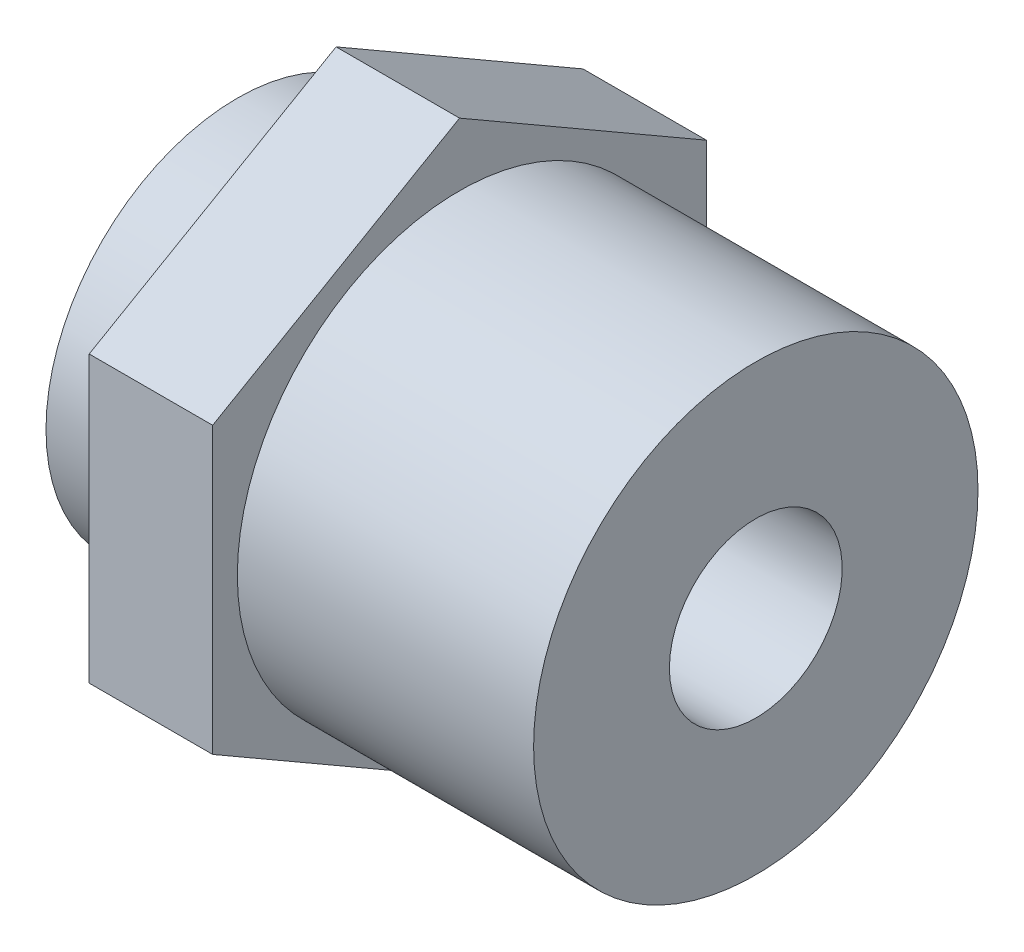
ISO-10303-21;
HEADER;
FILE_DESCRIPTION(('STEP AP214'),'2;1');
FILE_NAME('part.step','',(''),(''),'','','');
FILE_SCHEMA(('AUTOMOTIVE_DESIGN { 1 0 10303 214 1 1 1 1 }'));
ENDSEC;
DATA;
#1=APPLICATION_CONTEXT('core data for automotive mechanical design processes');
#2=APPLICATION_PROTOCOL_DEFINITION('international standard','automotive_design',2000,#1);
#3=PRODUCT_CONTEXT('',#1,'mechanical');
#4=PRODUCT('Part','Part','',(#3));
#5=PRODUCT_RELATED_PRODUCT_CATEGORY('part','',(#4));
#6=PRODUCT_DEFINITION_FORMATION('','',#4);
#7=PRODUCT_DEFINITION_CONTEXT('part definition',#1,'design');
#8=PRODUCT_DEFINITION('design','',#6,#7);
#9=PRODUCT_DEFINITION_SHAPE('','',#8);
#10=(LENGTH_UNIT() NAMED_UNIT(*) SI_UNIT(.MILLI.,.METRE.));
#11=(NAMED_UNIT(*) PLANE_ANGLE_UNIT() SI_UNIT($,.RADIAN.));
#12=(NAMED_UNIT(*) SI_UNIT($,.STERADIAN.) SOLID_ANGLE_UNIT());
#13=UNCERTAINTY_MEASURE_WITH_UNIT(LENGTH_MEASURE(1.E-05),#10,'distance_accuracy_value','');
#14=(GEOMETRIC_REPRESENTATION_CONTEXT(3) GLOBAL_UNCERTAINTY_ASSIGNED_CONTEXT((#13)) GLOBAL_UNIT_ASSIGNED_CONTEXT((#10,
#11,#12)) REPRESENTATION_CONTEXT('',''));
#15=CARTESIAN_POINT('',(0.,0.,0.));
#16=DIRECTION('',(0.,0.,1.));
#17=DIRECTION('',(1.,0.,0.));
#18=AXIS2_PLACEMENT_3D('',#15,#16,#17);
#19=CARTESIAN_POINT('',(-8.,0.,0.));
#20=DIRECTION('',(1.,0.,0.));
#21=DIRECTION('',(0.,0.,1.));
#22=AXIS2_PLACEMENT_3D('',#19,#20,#21);
#23=CYLINDRICAL_SURFACE('',#22,3.5);
#24=DIRECTION('',(1.,0.,0.));
#25=VECTOR('',#24,1.);
#26=CARTESIAN_POINT('',(-8.,0.,3.5));
#27=LINE('',#26,#25);
#28=CARTESIAN_POINT('',(-4.,0.,3.5));
#29=VERTEX_POINT('',#28);
#30=CARTESIAN_POINT('',(17.,0.,3.5));
#31=VERTEX_POINT('',#30);
#32=EDGE_CURVE('E9',#29,#31,#27,.T.);
#33=ORIENTED_EDGE('',*,*,#32,.F.);
#34=CARTESIAN_POINT('',(-4.,0.,0.));
#35=DIRECTION('',(1.,0.,0.));
#36=DIRECTION('',(0.,0.,1.));
#37=AXIS2_PLACEMENT_3D('',#34,#35,#36);
#38=CIRCLE('',#37,3.5);
#39=EDGE_CURVE('E169',#29,#29,#38,.T.);
#40=ORIENTED_EDGE('',*,*,#39,.F.);
#41=ORIENTED_EDGE('',*,*,#32,.T.);
#42=CARTESIAN_POINT('',(17.,0.,0.));
#43=DIRECTION('',(1.,0.,0.));
#44=DIRECTION('',(0.,0.,1.));
#45=AXIS2_PLACEMENT_3D('',#42,#43,#44);
#46=CIRCLE('',#45,3.5);
#47=EDGE_CURVE('E25',#31,#31,#46,.T.);
#48=ORIENTED_EDGE('',*,*,#47,.T.);
#49=EDGE_LOOP('',(#33,#40,#41,#48));
#50=FACE_BOUND('',#49,.T.);
#51=ADVANCED_FACE('F15',(#50),#23,.F.);
#52=CARTESIAN_POINT('',(17.,0.,0.));
#53=DIRECTION('',(1.,0.,0.));
#54=DIRECTION('',(0.,1.,0.));
#55=AXIS2_PLACEMENT_3D('',#52,#53,#54);
#56=PLANE('',#55);
#57=ORIENTED_EDGE('',*,*,#47,.F.);
#58=EDGE_LOOP('',(#57));
#59=FACE_BOUND('',#58,.T.);
#60=CARTESIAN_POINT('',(17.,0.,0.));
#61=DIRECTION('',(1.,0.,0.));
#62=DIRECTION('',(0.,0.,1.));
#63=AXIS2_PLACEMENT_3D('',#60,#61,#62);
#64=CIRCLE('',#63,9.);
#65=CARTESIAN_POINT('',(17.,0.,9.));
#66=VERTEX_POINT('',#65);
#67=EDGE_CURVE('E205',#66,#66,#64,.T.);
#68=ORIENTED_EDGE('',*,*,#67,.T.);
#69=EDGE_LOOP('',(#68));
#70=FACE_BOUND('',#69,.T.);
#71=ADVANCED_FACE('F220',(#59,#70),#56,.T.);
#72=CARTESIAN_POINT('',(-4.,0.,0.));
#73=DIRECTION('',(1.,0.,0.));
#74=DIRECTION('',(0.,1.,0.));
#75=AXIS2_PLACEMENT_3D('',#72,#73,#74);
#76=PLANE('',#75);
#77=ORIENTED_EDGE('',*,*,#39,.T.);
#78=EDGE_LOOP('',(#77));
#79=FACE_BOUND('',#78,.T.);
#80=CARTESIAN_POINT('',(-4.,0.,0.));
#81=DIRECTION('',(1.,0.,0.));
#82=DIRECTION('',(0.,0.,1.));
#83=AXIS2_PLACEMENT_3D('',#80,#81,#82);
#84=CIRCLE('',#83,7.75);
#85=CARTESIAN_POINT('',(-4.,0.,7.75));
#86=VERTEX_POINT('',#85);
#87=EDGE_CURVE('E82',#86,#86,#84,.T.);
#88=ORIENTED_EDGE('',*,*,#87,.F.);
#89=EDGE_LOOP('',(#88));
#90=FACE_BOUND('',#89,.T.);
#91=ADVANCED_FACE('F17',(#79,#90),#76,.F.);
#92=CARTESIAN_POINT('',(5.,0.,0.));
#93=DIRECTION('',(1.,0.,0.));
#94=DIRECTION('',(0.,0.,1.));
#95=AXIS2_PLACEMENT_3D('',#92,#93,#94);
#96=CYLINDRICAL_SURFACE('',#95,9.);
#97=ORIENTED_EDGE('',*,*,#67,.F.);
#98=DIRECTION('',(1.,0.,0.));
#99=VECTOR('',#98,1.);
#100=CARTESIAN_POINT('',(5.,0.,9.));
#101=LINE('',#100,#99);
#102=CARTESIAN_POINT('',(5.,0.,9.));
#103=VERTEX_POINT('',#102);
#104=EDGE_CURVE('E95',#103,#66,#101,.T.);
#105=ORIENTED_EDGE('',*,*,#104,.F.);
#106=CARTESIAN_POINT('',(5.,0.,0.));
#107=DIRECTION('',(1.,0.,0.));
#108=DIRECTION('',(0.,0.,1.));
#109=AXIS2_PLACEMENT_3D('',#106,#107,#108);
#110=CIRCLE('',#109,9.);
#111=EDGE_CURVE('E194',#103,#103,#110,.T.);
#112=ORIENTED_EDGE('',*,*,#111,.T.);
#113=ORIENTED_EDGE('',*,*,#104,.T.);
#114=EDGE_LOOP('',(#97,#105,#112,#113));
#115=FACE_BOUND('',#114,.T.);
#116=ADVANCED_FACE('F222',(#115),#96,.T.);
#117=CARTESIAN_POINT('',(-4.,0.,0.));
#118=DIRECTION('',(1.,0.,0.));
#119=DIRECTION('',(0.,0.,1.));
#120=AXIS2_PLACEMENT_3D('',#117,#118,#119);
#121=CYLINDRICAL_SURFACE('',#120,7.75);
#122=CARTESIAN_POINT('',(0.,0.,0.));
#123=DIRECTION('',(1.,0.,0.));
#124=DIRECTION('',(0.,0.,1.));
#125=AXIS2_PLACEMENT_3D('',#122,#123,#124);
#126=CIRCLE('',#125,7.75);
#127=CARTESIAN_POINT('',(0.,0.,7.75));
#128=VERTEX_POINT('',#127);
#129=EDGE_CURVE('E176',#128,#128,#126,.T.);
#130=ORIENTED_EDGE('',*,*,#129,.F.);
#131=DIRECTION('',(1.,0.,0.));
#132=VECTOR('',#131,1.);
#133=CARTESIAN_POINT('',(-4.,0.,7.75));
#134=LINE('',#133,#132);
#135=EDGE_CURVE('E210',#86,#128,#134,.T.);
#136=ORIENTED_EDGE('',*,*,#135,.F.);
#137=ORIENTED_EDGE('',*,*,#87,.T.);
#138=ORIENTED_EDGE('',*,*,#135,.T.);
#139=EDGE_LOOP('',(#130,#136,#137,#138));
#140=FACE_BOUND('',#139,.T.);
#141=ADVANCED_FACE('F254',(#140),#121,.T.);
#142=CARTESIAN_POINT('',(0.,-11.54700538379,0.));
#143=DIRECTION('',(0.,0.866025403784329,0.50000000000019));
#144=DIRECTION('',(1.,0.,0.));
#145=AXIS2_PLACEMENT_3D('',#142,#143,#144);
#146=PLANE('',#145);
#147=DIRECTION('',(0.,0.50000000000019,-0.866025403784329));
#148=VECTOR('',#147,1.);
#149=CARTESIAN_POINT('',(0.,-11.54700538379,0.));
#150=LINE('',#149,#148);
#151=CARTESIAN_POINT('',(0.,-11.54700538379,0.));
#152=VERTEX_POINT('',#151);
#153=CARTESIAN_POINT('',(0.,-5.773502691896,-10.));
#154=VERTEX_POINT('',#153);
#155=EDGE_CURVE('E186',#152,#154,#150,.T.);
#156=ORIENTED_EDGE('',*,*,#155,.T.);
#157=DIRECTION('',(1.,0.,0.));
#158=VECTOR('',#157,1.);
#159=CARTESIAN_POINT('',(0.,-5.773502691896,-10.));
#160=LINE('',#159,#158);
#161=CARTESIAN_POINT('',(5.,-5.773502691896,-10.));
#162=VERTEX_POINT('',#161);
#163=EDGE_CURVE('E196',#154,#162,#160,.T.);
#164=ORIENTED_EDGE('',*,*,#163,.T.);
#165=DIRECTION('',(0.,0.50000000000019,-0.866025403784329));
#166=VECTOR('',#165,1.);
#167=CARTESIAN_POINT('',(5.,-11.54700538379,0.));
#168=LINE('',#167,#166);
#169=CARTESIAN_POINT('',(5.,-11.54700538379,0.));
#170=VERTEX_POINT('',#169);
#171=EDGE_CURVE('E165',#170,#162,#168,.T.);
#172=ORIENTED_EDGE('',*,*,#171,.F.);
#173=DIRECTION('',(1.,0.,0.));
#174=VECTOR('',#173,1.);
#175=CARTESIAN_POINT('',(0.,-11.54700538379,0.));
#176=LINE('',#175,#174);
#177=EDGE_CURVE('E203',#152,#170,#176,.T.);
#178=ORIENTED_EDGE('',*,*,#177,.F.);
#179=EDGE_LOOP('',(#156,#164,#172,#178));
#180=FACE_BOUND('',#179,.T.);
#181=ADVANCED_FACE('F238',(#180),#146,.F.);
#182=CARTESIAN_POINT('',(0.,-5.773502691896,10.));
#183=DIRECTION('',(0.,0.866025403784329,-0.50000000000019));
#184=DIRECTION('',(-1.,0.,0.));
#185=AXIS2_PLACEMENT_3D('',#182,#183,#184);
#186=PLANE('',#185);
#187=DIRECTION('',(0.,-0.50000000000019,-0.866025403784329));
#188=VECTOR('',#187,1.);
#189=CARTESIAN_POINT('',(0.,-5.773502691896,10.));
#190=LINE('',#189,#188);
#191=CARTESIAN_POINT('',(0.,-5.773502691896,10.));
#192=VERTEX_POINT('',#191);
#193=EDGE_CURVE('E179',#192,#152,#190,.T.);
#194=ORIENTED_EDGE('',*,*,#193,.T.);
#195=ORIENTED_EDGE('',*,*,#177,.T.);
#196=DIRECTION('',(0.,-0.50000000000019,-0.866025403784329));
#197=VECTOR('',#196,1.);
#198=CARTESIAN_POINT('',(5.,-5.773502691896,10.));
#199=LINE('',#198,#197);
#200=CARTESIAN_POINT('',(5.,-5.773502691896,10.));
#201=VERTEX_POINT('',#200);
#202=EDGE_CURVE('E170',#201,#170,#199,.T.);
#203=ORIENTED_EDGE('',*,*,#202,.F.);
#204=DIRECTION('',(1.,0.,0.));
#205=VECTOR('',#204,1.);
#206=CARTESIAN_POINT('',(0.,-5.773502691896,10.));
#207=LINE('',#206,#205);
#208=EDGE_CURVE('E160',#192,#201,#207,.T.);
#209=ORIENTED_EDGE('',*,*,#208,.F.);
#210=EDGE_LOOP('',(#194,#195,#203,#209));
#211=FACE_BOUND('',#210,.T.);
#212=ADVANCED_FACE('F233',(#211),#186,.F.);
#213=CARTESIAN_POINT('',(0.,-5.773502691896,-10.));
#214=DIRECTION('',(0.,0.,1.));
#215=DIRECTION('',(0.,-1.,0.));
#216=AXIS2_PLACEMENT_3D('',#213,#214,#215);
#217=PLANE('',#216);
#218=DIRECTION('',(0.,1.,0.));
#219=VECTOR('',#218,1.);
#220=CARTESIAN_POINT('',(0.,-5.773502691896,-10.));
#221=LINE('',#220,#219);
#222=CARTESIAN_POINT('',(0.,5.773502691896,-10.));
#223=VERTEX_POINT('',#222);
#224=EDGE_CURVE('E175',#154,#223,#221,.T.);
#225=ORIENTED_EDGE('',*,*,#224,.T.);
#226=DIRECTION('',(1.,0.,0.));
#227=VECTOR('',#226,1.);
#228=CARTESIAN_POINT('',(0.,5.773502691896,-10.));
#229=LINE('',#228,#227);
#230=CARTESIAN_POINT('',(5.,5.773502691896,-10.));
#231=VERTEX_POINT('',#230);
#232=EDGE_CURVE('E121',#223,#231,#229,.T.);
#233=ORIENTED_EDGE('',*,*,#232,.T.);
#234=DIRECTION('',(0.,1.,0.));
#235=VECTOR('',#234,1.);
#236=CARTESIAN_POINT('',(5.,-5.773502691896,-10.));
#237=LINE('',#236,#235);
#238=EDGE_CURVE('E167',#162,#231,#237,.T.);
#239=ORIENTED_EDGE('',*,*,#238,.F.);
#240=ORIENTED_EDGE('',*,*,#163,.F.);
#241=EDGE_LOOP('',(#225,#233,#239,#240));
#242=FACE_BOUND('',#241,.T.);
#243=ADVANCED_FACE('F227',(#242),#217,.F.);
#244=CARTESIAN_POINT('',(5.,0.,0.));
#245=DIRECTION('',(1.,0.,0.));
#246=DIRECTION('',(0.,1.,0.));
#247=AXIS2_PLACEMENT_3D('',#244,#245,#246);
#248=PLANE('',#247);
#249=ORIENTED_EDGE('',*,*,#111,.F.);
#250=EDGE_LOOP('',(#249));
#251=FACE_BOUND('',#250,.T.);
#252=DIRECTION('',(0.,-0.50000000000019,0.866025403784329));
#253=VECTOR('',#252,1.);
#254=CARTESIAN_POINT('',(5.,11.547005383793,0.));
#255=LINE('',#254,#253);
#256=CARTESIAN_POINT('',(5.,11.547005383793,0.));
#257=VERTEX_POINT('',#256);
#258=CARTESIAN_POINT('',(5.,5.773502691896,10.));
#259=VERTEX_POINT('',#258);
#260=EDGE_CURVE('E133',#257,#259,#255,.T.);
#261=ORIENTED_EDGE('',*,*,#260,.T.);
#262=DIRECTION('',(0.,-1.,0.));
#263=VECTOR('',#262,1.);
#264=CARTESIAN_POINT('',(5.,5.773502691896,10.));
#265=LINE('',#264,#263);
#266=EDGE_CURVE('E161',#259,#201,#265,.T.);
#267=ORIENTED_EDGE('',*,*,#266,.T.);
#268=ORIENTED_EDGE('',*,*,#202,.T.);
#269=ORIENTED_EDGE('',*,*,#171,.T.);
#270=ORIENTED_EDGE('',*,*,#238,.T.);
#271=DIRECTION('',(0.,0.50000000000019,0.866025403784329));
#272=VECTOR('',#271,1.);
#273=CARTESIAN_POINT('',(5.,5.773502691896,-10.));
#274=LINE('',#273,#272);
#275=EDGE_CURVE('E130',#231,#257,#274,.T.);
#276=ORIENTED_EDGE('',*,*,#275,.T.);
#277=EDGE_LOOP('',(#261,#267,#268,#269,#270,#276));
#278=FACE_BOUND('',#277,.T.);
#279=ADVANCED_FACE('F221',(#251,#278),#248,.T.);
#280=CARTESIAN_POINT('',(0.,0.,0.));
#281=DIRECTION('',(1.,0.,0.));
#282=DIRECTION('',(0.,1.,0.));
#283=AXIS2_PLACEMENT_3D('',#280,#281,#282);
#284=PLANE('',#283);
#285=ORIENTED_EDGE('',*,*,#129,.T.);
#286=EDGE_LOOP('',(#285));
#287=FACE_BOUND('',#286,.T.);
#288=DIRECTION('',(0.,0.50000000000019,0.866025403784329));
#289=VECTOR('',#288,1.);
#290=CARTESIAN_POINT('',(0.,5.773502691896,-10.));
#291=LINE('',#290,#289);
#292=CARTESIAN_POINT('',(0.,11.547005383793,0.));
#293=VERTEX_POINT('',#292);
#294=EDGE_CURVE('E111',#223,#293,#291,.T.);
#295=ORIENTED_EDGE('',*,*,#294,.F.);
#296=ORIENTED_EDGE('',*,*,#224,.F.);
#297=ORIENTED_EDGE('',*,*,#155,.F.);
#298=ORIENTED_EDGE('',*,*,#193,.F.);
#299=DIRECTION('',(0.,-1.,0.));
#300=VECTOR('',#299,1.);
#301=CARTESIAN_POINT('',(0.,5.773502691896,10.));
#302=LINE('',#301,#300);
#303=CARTESIAN_POINT('',(0.,5.773502691896,10.));
#304=VERTEX_POINT('',#303);
#305=EDGE_CURVE('E137',#304,#192,#302,.T.);
#306=ORIENTED_EDGE('',*,*,#305,.F.);
#307=DIRECTION('',(0.,-0.50000000000019,0.866025403784329));
#308=VECTOR('',#307,1.);
#309=CARTESIAN_POINT('',(0.,11.547005383793,0.));
#310=LINE('',#309,#308);
#311=EDGE_CURVE('E135',#293,#304,#310,.T.);
#312=ORIENTED_EDGE('',*,*,#311,.F.);
#313=EDGE_LOOP('',(#295,#296,#297,#298,#306,#312));
#314=FACE_BOUND('',#313,.T.);
#315=ADVANCED_FACE('F140',(#287,#314),#284,.F.);
#316=CARTESIAN_POINT('',(0.,5.773502691896,10.));
#317=DIRECTION('',(0.,0.,-1.));
#318=DIRECTION('',(0.,-1.,0.));
#319=AXIS2_PLACEMENT_3D('',#316,#317,#318);
#320=PLANE('',#319);
#321=ORIENTED_EDGE('',*,*,#305,.T.);
#322=ORIENTED_EDGE('',*,*,#208,.T.);
#323=ORIENTED_EDGE('',*,*,#266,.F.);
#324=DIRECTION('',(1.,0.,0.));
#325=VECTOR('',#324,1.);
#326=CARTESIAN_POINT('',(0.,5.773502691896,10.));
#327=LINE('',#326,#325);
#328=EDGE_CURVE('E142',#304,#259,#327,.T.);
#329=ORIENTED_EDGE('',*,*,#328,.F.);
#330=EDGE_LOOP('',(#321,#322,#323,#329));
#331=FACE_BOUND('',#330,.T.);
#332=ADVANCED_FACE('F230',(#331),#320,.F.);
#333=CARTESIAN_POINT('',(0.,5.773502691896,-10.));
#334=DIRECTION('',(0.,-0.866025403784329,0.50000000000019));
#335=DIRECTION('',(-1.,0.,0.));
#336=AXIS2_PLACEMENT_3D('',#333,#334,#335);
#337=PLANE('',#336);
#338=ORIENTED_EDGE('',*,*,#294,.T.);
#339=DIRECTION('',(1.,0.,0.));
#340=VECTOR('',#339,1.);
#341=CARTESIAN_POINT('',(0.,11.547005383793,0.));
#342=LINE('',#341,#340);
#343=EDGE_CURVE('E119',#293,#257,#342,.T.);
#344=ORIENTED_EDGE('',*,*,#343,.T.);
#345=ORIENTED_EDGE('',*,*,#275,.F.);
#346=ORIENTED_EDGE('',*,*,#232,.F.);
#347=EDGE_LOOP('',(#338,#344,#345,#346));
#348=FACE_BOUND('',#347,.T.);
#349=ADVANCED_FACE('F116',(#348),#337,.F.);
#350=CARTESIAN_POINT('',(0.,11.547005383793,0.));
#351=DIRECTION('',(0.,-0.866025403784329,-0.50000000000019));
#352=DIRECTION('',(0.,0.50000000000019,-0.866025403784329));
#353=AXIS2_PLACEMENT_3D('',#350,#351,#352);
#354=PLANE('',#353);
#355=ORIENTED_EDGE('',*,*,#311,.T.);
#356=ORIENTED_EDGE('',*,*,#328,.T.);
#357=ORIENTED_EDGE('',*,*,#260,.F.);
#358=ORIENTED_EDGE('',*,*,#343,.F.);
#359=EDGE_LOOP('',(#355,#356,#357,#358));
#360=FACE_BOUND('',#359,.T.);
#361=ADVANCED_FACE('F129',(#360),#354,.F.);
#362=CLOSED_SHELL('',(#51,#71,#91,#116,#141,#181,#212,#243,#279,#315,#332,#349,#361));
#363=MANIFOLD_SOLID_BREP('B1',#362);
#364=ADVANCED_BREP_SHAPE_REPRESENTATION('',(#18,#363),#14);
#365=SHAPE_DEFINITION_REPRESENTATION(#9,#364);
ENDSEC;
END-ISO-10303-21;
